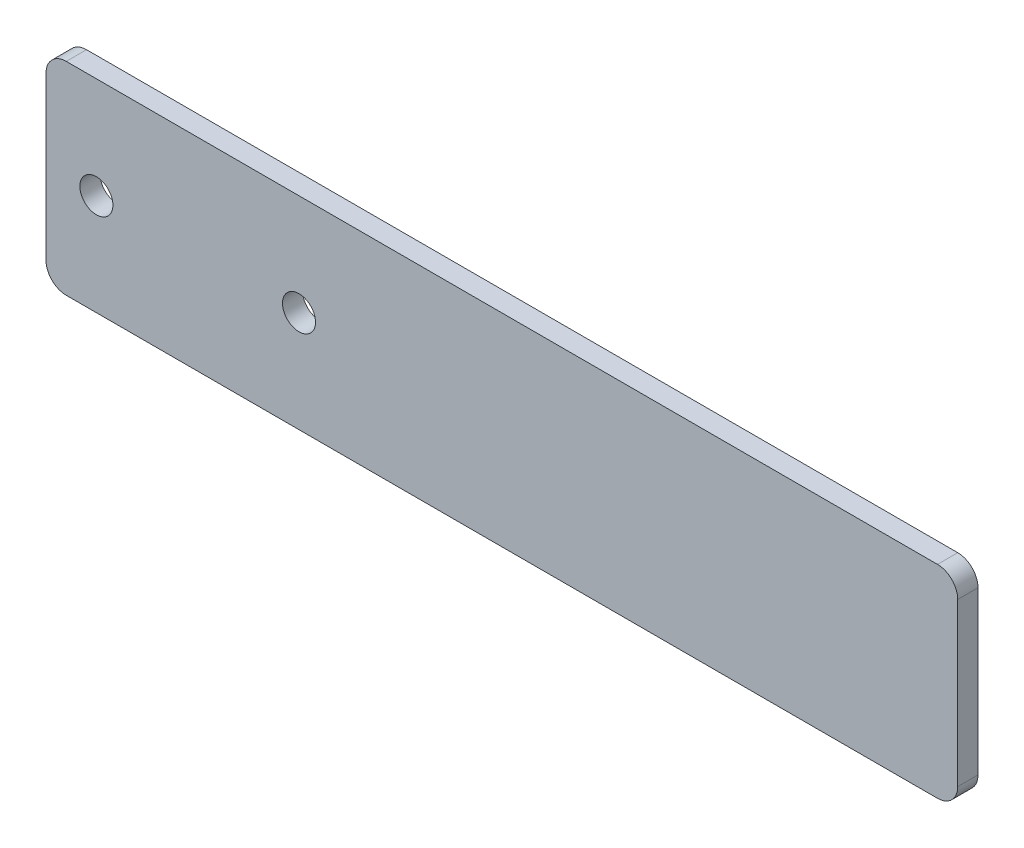
ISO-10303-21;
HEADER;
FILE_DESCRIPTION(('STEP AP214'),'2;1');
FILE_NAME('part.step','',(''),(''),'','','');
FILE_SCHEMA(('AUTOMOTIVE_DESIGN { 1 0 10303 214 1 1 1 1 }'));
ENDSEC;
DATA;
#1=APPLICATION_CONTEXT('core data for automotive mechanical design processes');
#2=APPLICATION_PROTOCOL_DEFINITION('international standard','automotive_design',2000,#1);
#3=PRODUCT_CONTEXT('',#1,'mechanical');
#4=PRODUCT('Part','Part','',(#3));
#5=PRODUCT_RELATED_PRODUCT_CATEGORY('part','',(#4));
#6=PRODUCT_DEFINITION_FORMATION('','',#4);
#7=PRODUCT_DEFINITION_CONTEXT('part definition',#1,'design');
#8=PRODUCT_DEFINITION('design','',#6,#7);
#9=PRODUCT_DEFINITION_SHAPE('','',#8);
#10=(LENGTH_UNIT() NAMED_UNIT(*) SI_UNIT(.MILLI.,.METRE.));
#11=(NAMED_UNIT(*) PLANE_ANGLE_UNIT() SI_UNIT($,.RADIAN.));
#12=(NAMED_UNIT(*) SI_UNIT($,.STERADIAN.) SOLID_ANGLE_UNIT());
#13=UNCERTAINTY_MEASURE_WITH_UNIT(LENGTH_MEASURE(1.E-05),#10,'distance_accuracy_value','');
#14=(GEOMETRIC_REPRESENTATION_CONTEXT(3) GLOBAL_UNCERTAINTY_ASSIGNED_CONTEXT((#13)) GLOBAL_UNIT_ASSIGNED_CONTEXT((#10,
#11,#12)) REPRESENTATION_CONTEXT('',''));
#15=CARTESIAN_POINT('',(0.,0.,0.));
#16=DIRECTION('',(0.,0.,1.));
#17=DIRECTION('',(1.,0.,0.));
#18=AXIS2_PLACEMENT_3D('',#15,#16,#17);
#19=CARTESIAN_POINT('',(0.,0.,2.54));
#20=DIRECTION('',(0.,0.,-1.));
#21=DIRECTION('',(-1.,0.,0.));
#22=AXIS2_PLACEMENT_3D('',#19,#20,#21);
#23=PLANE('',#22);
#24=DIRECTION('',(1.,0.,0.));
#25=VECTOR('',#24,1.);
#26=CARTESIAN_POINT('',(1628.44789263694,177.196529369141,2.54));
#27=LINE('',#26,#25);
#28=CARTESIAN_POINT('',(1516.68789263694,177.196529369141,2.54));
#29=VERTEX_POINT('',#28);
#30=CARTESIAN_POINT('',(1625.90789263694,177.196529369141,2.54));
#31=VERTEX_POINT('',#30);
#32=EDGE_CURVE('E210',#29,#31,#27,.T.);
#33=ORIENTED_EDGE('',*,*,#32,.T.);
#34=CARTESIAN_POINT('',(1625.90789263694,179.736529369141,2.54));
#35=DIRECTION('',(0.,0.,-1.));
#36=DIRECTION('',(-1.,0.,0.));
#37=AXIS2_PLACEMENT_3D('',#34,#35,#36);
#38=CIRCLE('',#37,2.54);
#39=CARTESIAN_POINT('',(1628.44789263694,179.736529369141,2.54));
#40=VERTEX_POINT('',#39);
#41=EDGE_CURVE('E189',#31,#40,#38,.F.);
#42=ORIENTED_EDGE('',*,*,#41,.T.);
#43=DIRECTION('',(0.,1.,0.));
#44=VECTOR('',#43,1.);
#45=CARTESIAN_POINT('',(1628.44789263694,202.596529369141,2.54));
#46=LINE('',#45,#44);
#47=CARTESIAN_POINT('',(1628.44789263694,200.056529369141,2.54));
#48=VERTEX_POINT('',#47);
#49=EDGE_CURVE('E145',#40,#48,#46,.T.);
#50=ORIENTED_EDGE('',*,*,#49,.T.);
#51=CARTESIAN_POINT('',(1625.90789263694,200.056529369141,2.54));
#52=DIRECTION('',(0.,0.,-1.));
#53=DIRECTION('',(-1.,0.,0.));
#54=AXIS2_PLACEMENT_3D('',#51,#52,#53);
#55=CIRCLE('',#54,2.54);
#56=CARTESIAN_POINT('',(1625.90789263694,202.596529369141,2.54));
#57=VERTEX_POINT('',#56);
#58=EDGE_CURVE('E186',#48,#57,#55,.F.);
#59=ORIENTED_EDGE('',*,*,#58,.T.);
#60=DIRECTION('',(-1.,0.,0.));
#61=VECTOR('',#60,1.);
#62=CARTESIAN_POINT('',(1514.14789263694,202.596529369141,2.54));
#63=LINE('',#62,#61);
#64=CARTESIAN_POINT('',(1516.68789263694,202.596529369141,2.54));
#65=VERTEX_POINT('',#64);
#66=EDGE_CURVE('E154',#57,#65,#63,.T.);
#67=ORIENTED_EDGE('',*,*,#66,.T.);
#68=CARTESIAN_POINT('',(1516.68789263694,200.056529369141,2.54));
#69=DIRECTION('',(0.,0.,-1.));
#70=DIRECTION('',(-1.,0.,0.));
#71=AXIS2_PLACEMENT_3D('',#68,#69,#70);
#72=CIRCLE('',#71,2.54);
#73=CARTESIAN_POINT('',(1514.14789263694,200.056529369141,2.54));
#74=VERTEX_POINT('',#73);
#75=EDGE_CURVE('E69',#65,#74,#72,.F.);
#76=ORIENTED_EDGE('',*,*,#75,.T.);
#77=DIRECTION('',(0.,-1.,0.));
#78=VECTOR('',#77,1.);
#79=CARTESIAN_POINT('',(1514.14789263694,177.196529369141,2.54));
#80=LINE('',#79,#78);
#81=CARTESIAN_POINT('',(1514.14789263694,179.736529369141,2.54));
#82=VERTEX_POINT('',#81);
#83=EDGE_CURVE('E160',#74,#82,#80,.T.);
#84=ORIENTED_EDGE('',*,*,#83,.T.);
#85=CARTESIAN_POINT('',(1516.68789263694,179.736529369141,2.54));
#86=DIRECTION('',(0.,0.,-1.));
#87=DIRECTION('',(-1.,0.,0.));
#88=AXIS2_PLACEMENT_3D('',#85,#86,#87);
#89=CIRCLE('',#88,2.54);
#90=EDGE_CURVE('E181',#82,#29,#89,.F.);
#91=ORIENTED_EDGE('',*,*,#90,.T.);
#92=EDGE_LOOP('',(#33,#42,#50,#59,#67,#76,#84,#91));
#93=FACE_BOUND('',#92,.T.);
#94=CARTESIAN_POINT('',(1545.8653348212,189.896529369176,2.54));
#95=DIRECTION('',(0.,0.,1.));
#96=DIRECTION('',(1.,0.,0.));
#97=AXIS2_PLACEMENT_3D('',#94,#95,#96);
#98=CIRCLE('',#97,2.07009999999992);
#99=CARTESIAN_POINT('',(1547.9354348212,189.896529369176,2.54));
#100=VERTEX_POINT('',#99);
#101=EDGE_CURVE('E214',#100,#100,#98,.T.);
#102=ORIENTED_EDGE('',*,*,#101,.F.);
#103=EDGE_LOOP('',(#102));
#104=FACE_BOUND('',#103,.T.);
#105=CARTESIAN_POINT('',(1520.4653348212,189.896529369168,2.54));
#106=DIRECTION('',(0.,0.,1.));
#107=DIRECTION('',(1.,0.,0.));
#108=AXIS2_PLACEMENT_3D('',#105,#106,#107);
#109=CIRCLE('',#108,2.07009999999992);
#110=CARTESIAN_POINT('',(1522.5354348212,189.896529369168,2.54));
#111=VERTEX_POINT('',#110);
#112=EDGE_CURVE('E200',#111,#111,#109,.T.);
#113=ORIENTED_EDGE('',*,*,#112,.F.);
#114=EDGE_LOOP('',(#113));
#115=FACE_BOUND('',#114,.T.);
#116=ADVANCED_FACE('F41',(#93,#104,#115),#23,.F.);
#117=CARTESIAN_POINT('',(0.,0.,0.));
#118=DIRECTION('',(0.,0.,-1.));
#119=DIRECTION('',(-1.,0.,0.));
#120=AXIS2_PLACEMENT_3D('',#117,#118,#119);
#121=PLANE('',#120);
#122=CARTESIAN_POINT('',(1545.8653348212,189.896529369176,0.));
#123=DIRECTION('',(0.,0.,1.));
#124=DIRECTION('',(1.,0.,0.));
#125=AXIS2_PLACEMENT_3D('',#122,#123,#124);
#126=CIRCLE('',#125,2.07009999999992);
#127=CARTESIAN_POINT('',(1547.9354348212,189.896529369176,0.));
#128=VERTEX_POINT('',#127);
#129=EDGE_CURVE('E203',#128,#128,#126,.T.);
#130=ORIENTED_EDGE('',*,*,#129,.T.);
#131=EDGE_LOOP('',(#130));
#132=FACE_BOUND('',#131,.T.);
#133=DIRECTION('',(0.,1.,0.));
#134=VECTOR('',#133,1.);
#135=CARTESIAN_POINT('',(1628.44789263694,202.596529369141,0.));
#136=LINE('',#135,#134);
#137=CARTESIAN_POINT('',(1628.44789263694,179.736529369141,0.));
#138=VERTEX_POINT('',#137);
#139=CARTESIAN_POINT('',(1628.44789263694,200.056529369141,0.));
#140=VERTEX_POINT('',#139);
#141=EDGE_CURVE('E142',#138,#140,#136,.T.);
#142=ORIENTED_EDGE('',*,*,#141,.F.);
#143=CARTESIAN_POINT('',(1625.90789263694,179.736529369141,0.));
#144=DIRECTION('',(0.,0.,-1.));
#145=DIRECTION('',(-1.,0.,0.));
#146=AXIS2_PLACEMENT_3D('',#143,#144,#145);
#147=CIRCLE('',#146,2.54);
#148=CARTESIAN_POINT('',(1625.90789263694,177.196529369141,0.));
#149=VERTEX_POINT('',#148);
#150=EDGE_CURVE('E124',#138,#149,#147,.T.);
#151=ORIENTED_EDGE('',*,*,#150,.T.);
#152=DIRECTION('',(1.,0.,0.));
#153=VECTOR('',#152,1.);
#154=CARTESIAN_POINT('',(1628.44789263694,177.196529369141,0.));
#155=LINE('',#154,#153);
#156=CARTESIAN_POINT('',(1516.68789263694,177.196529369141,0.));
#157=VERTEX_POINT('',#156);
#158=EDGE_CURVE('E155',#157,#149,#155,.T.);
#159=ORIENTED_EDGE('',*,*,#158,.F.);
#160=CARTESIAN_POINT('',(1516.68789263694,179.736529369141,0.));
#161=DIRECTION('',(0.,0.,-1.));
#162=DIRECTION('',(-1.,0.,0.));
#163=AXIS2_PLACEMENT_3D('',#160,#161,#162);
#164=CIRCLE('',#163,2.54);
#165=CARTESIAN_POINT('',(1514.14789263694,179.736529369141,0.));
#166=VERTEX_POINT('',#165);
#167=EDGE_CURVE('E147',#157,#166,#164,.T.);
#168=ORIENTED_EDGE('',*,*,#167,.T.);
#169=DIRECTION('',(0.,-1.,0.));
#170=VECTOR('',#169,1.);
#171=CARTESIAN_POINT('',(1514.14789263694,177.196529369141,0.));
#172=LINE('',#171,#170);
#173=CARTESIAN_POINT('',(1514.14789263694,200.056529369141,0.));
#174=VERTEX_POINT('',#173);
#175=EDGE_CURVE('E163',#174,#166,#172,.T.);
#176=ORIENTED_EDGE('',*,*,#175,.F.);
#177=CARTESIAN_POINT('',(1516.68789263694,200.056529369141,0.));
#178=DIRECTION('',(0.,0.,-1.));
#179=DIRECTION('',(-1.,0.,0.));
#180=AXIS2_PLACEMENT_3D('',#177,#178,#179);
#181=CIRCLE('',#180,2.54);
#182=CARTESIAN_POINT('',(1516.68789263694,202.596529369141,0.));
#183=VERTEX_POINT('',#182);
#184=EDGE_CURVE('E171',#174,#183,#181,.T.);
#185=ORIENTED_EDGE('',*,*,#184,.T.);
#186=DIRECTION('',(-1.,0.,0.));
#187=VECTOR('',#186,1.);
#188=CARTESIAN_POINT('',(1514.14789263694,202.596529369141,0.));
#189=LINE('',#188,#187);
#190=CARTESIAN_POINT('',(1625.90789263694,202.596529369141,0.));
#191=VERTEX_POINT('',#190);
#192=EDGE_CURVE('E213',#191,#183,#189,.T.);
#193=ORIENTED_EDGE('',*,*,#192,.F.);
#194=CARTESIAN_POINT('',(1625.90789263694,200.056529369141,0.));
#195=DIRECTION('',(0.,0.,-1.));
#196=DIRECTION('',(-1.,0.,0.));
#197=AXIS2_PLACEMENT_3D('',#194,#195,#196);
#198=CIRCLE('',#197,2.54);
#199=EDGE_CURVE('E136',#191,#140,#198,.T.);
#200=ORIENTED_EDGE('',*,*,#199,.T.);
#201=EDGE_LOOP('',(#142,#151,#159,#168,#176,#185,#193,#200));
#202=FACE_BOUND('',#201,.T.);
#203=CARTESIAN_POINT('',(1520.4653348212,189.896529369168,0.));
#204=DIRECTION('',(0.,0.,1.));
#205=DIRECTION('',(1.,0.,0.));
#206=AXIS2_PLACEMENT_3D('',#203,#204,#205);
#207=CIRCLE('',#206,2.07009999999992);
#208=CARTESIAN_POINT('',(1522.5354348212,189.896529369168,0.));
#209=VERTEX_POINT('',#208);
#210=EDGE_CURVE('E204',#209,#209,#207,.T.);
#211=ORIENTED_EDGE('',*,*,#210,.T.);
#212=EDGE_LOOP('',(#211));
#213=FACE_BOUND('',#212,.T.);
#214=ADVANCED_FACE('F150',(#132,#202,#213),#121,.T.);
#215=CARTESIAN_POINT('',(1514.14789263694,202.596529369141,2.54));
#216=DIRECTION('',(0.,-1.,0.));
#217=DIRECTION('',(0.,0.,-1.));
#218=AXIS2_PLACEMENT_3D('',#215,#216,#217);
#219=PLANE('',#218);
#220=ORIENTED_EDGE('',*,*,#66,.F.);
#221=DIRECTION('',(0.,0.,-1.));
#222=VECTOR('',#221,1.);
#223=CARTESIAN_POINT('',(1625.90789263694,202.596529369141,2.54));
#224=LINE('',#223,#222);
#225=EDGE_CURVE('E195',#57,#191,#224,.T.);
#226=ORIENTED_EDGE('',*,*,#225,.T.);
#227=ORIENTED_EDGE('',*,*,#192,.T.);
#228=DIRECTION('',(0.,0.,-1.));
#229=VECTOR('',#228,1.);
#230=CARTESIAN_POINT('',(1516.68789263694,202.596529369141,2.54));
#231=LINE('',#230,#229);
#232=EDGE_CURVE('E192',#183,#65,#231,.F.);
#233=ORIENTED_EDGE('',*,*,#232,.T.);
#234=EDGE_LOOP('',(#220,#226,#227,#233));
#235=FACE_BOUND('',#234,.T.);
#236=ADVANCED_FACE('F242',(#235),#219,.F.);
#237=CARTESIAN_POINT('',(1514.14789263694,177.196529369141,2.54));
#238=DIRECTION('',(1.,0.,0.));
#239=DIRECTION('',(0.,0.,-1.));
#240=AXIS2_PLACEMENT_3D('',#237,#238,#239);
#241=PLANE('',#240);
#242=ORIENTED_EDGE('',*,*,#83,.F.);
#243=DIRECTION('',(0.,0.,-1.));
#244=VECTOR('',#243,1.);
#245=CARTESIAN_POINT('',(1514.14789263694,200.056529369141,2.54));
#246=LINE('',#245,#244);
#247=EDGE_CURVE('E11',#74,#174,#246,.T.);
#248=ORIENTED_EDGE('',*,*,#247,.T.);
#249=ORIENTED_EDGE('',*,*,#175,.T.);
#250=DIRECTION('',(0.,0.,-1.));
#251=VECTOR('',#250,1.);
#252=CARTESIAN_POINT('',(1514.14789263694,179.736529369141,2.54));
#253=LINE('',#252,#251);
#254=EDGE_CURVE('E50',#166,#82,#253,.F.);
#255=ORIENTED_EDGE('',*,*,#254,.T.);
#256=EDGE_LOOP('',(#242,#248,#249,#255));
#257=FACE_BOUND('',#256,.T.);
#258=ADVANCED_FACE('F235',(#257),#241,.F.);
#259=CARTESIAN_POINT('',(1628.44789263694,177.196529369141,2.54));
#260=DIRECTION('',(0.,1.,0.));
#261=DIRECTION('',(0.,0.,1.));
#262=AXIS2_PLACEMENT_3D('',#259,#260,#261);
#263=PLANE('',#262);
#264=ORIENTED_EDGE('',*,*,#158,.T.);
#265=DIRECTION('',(0.,0.,-1.));
#266=VECTOR('',#265,1.);
#267=CARTESIAN_POINT('',(1625.90789263694,177.196529369141,2.54));
#268=LINE('',#267,#266);
#269=EDGE_CURVE('E129',#149,#31,#268,.F.);
#270=ORIENTED_EDGE('',*,*,#269,.T.);
#271=ORIENTED_EDGE('',*,*,#32,.F.);
#272=DIRECTION('',(0.,0.,-1.));
#273=VECTOR('',#272,1.);
#274=CARTESIAN_POINT('',(1516.68789263694,177.196529369141,2.54));
#275=LINE('',#274,#273);
#276=EDGE_CURVE('E135',#29,#157,#275,.T.);
#277=ORIENTED_EDGE('',*,*,#276,.T.);
#278=EDGE_LOOP('',(#264,#270,#271,#277));
#279=FACE_BOUND('',#278,.T.);
#280=ADVANCED_FACE('F232',(#279),#263,.F.);
#281=CARTESIAN_POINT('',(1628.44789263694,202.596529369141,2.54));
#282=DIRECTION('',(-1.,0.,0.));
#283=DIRECTION('',(0.,0.,1.));
#284=AXIS2_PLACEMENT_3D('',#281,#282,#283);
#285=PLANE('',#284);
#286=ORIENTED_EDGE('',*,*,#49,.F.);
#287=DIRECTION('',(0.,0.,-1.));
#288=VECTOR('',#287,1.);
#289=CARTESIAN_POINT('',(1628.44789263694,179.736529369141,2.54));
#290=LINE('',#289,#288);
#291=EDGE_CURVE('E128',#40,#138,#290,.T.);
#292=ORIENTED_EDGE('',*,*,#291,.T.);
#293=ORIENTED_EDGE('',*,*,#141,.T.);
#294=DIRECTION('',(0.,0.,-1.));
#295=VECTOR('',#294,1.);
#296=CARTESIAN_POINT('',(1628.44789263694,200.056529369141,2.54));
#297=LINE('',#296,#295);
#298=EDGE_CURVE('E148',#140,#48,#297,.F.);
#299=ORIENTED_EDGE('',*,*,#298,.T.);
#300=EDGE_LOOP('',(#286,#292,#293,#299));
#301=FACE_BOUND('',#300,.T.);
#302=ADVANCED_FACE('F141',(#301),#285,.F.);
#303=CARTESIAN_POINT('',(1545.8653348212,189.896529369176,2.54));
#304=DIRECTION('',(0.,0.,-1.));
#305=DIRECTION('',(-1.,0.,0.));
#306=AXIS2_PLACEMENT_3D('',#303,#304,#305);
#307=CYLINDRICAL_SURFACE('',#306,2.07009999999992);
#308=ORIENTED_EDGE('',*,*,#101,.T.);
#309=EDGE_LOOP('',(#308));
#310=FACE_BOUND('',#309,.T.);
#311=ORIENTED_EDGE('',*,*,#129,.F.);
#312=EDGE_LOOP('',(#311));
#313=FACE_BOUND('',#312,.T.);
#314=ADVANCED_FACE('F262',(#310,#313),#307,.F.);
#315=CARTESIAN_POINT('',(1520.4653348212,189.896529369168,2.54));
#316=DIRECTION('',(0.,0.,-1.));
#317=DIRECTION('',(-1.,0.,0.));
#318=AXIS2_PLACEMENT_3D('',#315,#316,#317);
#319=CYLINDRICAL_SURFACE('',#318,2.07009999999992);
#320=ORIENTED_EDGE('',*,*,#112,.T.);
#321=EDGE_LOOP('',(#320));
#322=FACE_BOUND('',#321,.T.);
#323=ORIENTED_EDGE('',*,*,#210,.F.);
#324=EDGE_LOOP('',(#323));
#325=FACE_BOUND('',#324,.T.);
#326=ADVANCED_FACE('F252',(#322,#325),#319,.F.);
#327=CARTESIAN_POINT('',(1625.90789263694,179.736529369141,2.54));
#328=DIRECTION('',(0.,0.,-1.));
#329=DIRECTION('',(-1.,0.,0.));
#330=AXIS2_PLACEMENT_3D('',#327,#328,#329);
#331=CYLINDRICAL_SURFACE('',#330,2.54);
#332=ORIENTED_EDGE('',*,*,#41,.F.);
#333=ORIENTED_EDGE('',*,*,#269,.F.);
#334=ORIENTED_EDGE('',*,*,#150,.F.);
#335=ORIENTED_EDGE('',*,*,#291,.F.);
#336=EDGE_LOOP('',(#332,#333,#334,#335));
#337=FACE_BOUND('',#336,.T.);
#338=ADVANCED_FACE('F127',(#337),#331,.T.);
#339=CARTESIAN_POINT('',(1625.90789263694,200.056529369141,2.54));
#340=DIRECTION('',(0.,0.,-1.));
#341=DIRECTION('',(-1.,0.,0.));
#342=AXIS2_PLACEMENT_3D('',#339,#340,#341);
#343=CYLINDRICAL_SURFACE('',#342,2.54);
#344=ORIENTED_EDGE('',*,*,#58,.F.);
#345=ORIENTED_EDGE('',*,*,#298,.F.);
#346=ORIENTED_EDGE('',*,*,#199,.F.);
#347=ORIENTED_EDGE('',*,*,#225,.F.);
#348=EDGE_LOOP('',(#344,#345,#346,#347));
#349=FACE_BOUND('',#348,.T.);
#350=ADVANCED_FACE('F245',(#349),#343,.T.);
#351=CARTESIAN_POINT('',(1516.68789263694,200.056529369141,2.54));
#352=DIRECTION('',(0.,0.,-1.));
#353=DIRECTION('',(-1.,0.,0.));
#354=AXIS2_PLACEMENT_3D('',#351,#352,#353);
#355=CYLINDRICAL_SURFACE('',#354,2.54);
#356=ORIENTED_EDGE('',*,*,#75,.F.);
#357=ORIENTED_EDGE('',*,*,#232,.F.);
#358=ORIENTED_EDGE('',*,*,#184,.F.);
#359=ORIENTED_EDGE('',*,*,#247,.F.);
#360=EDGE_LOOP('',(#356,#357,#358,#359));
#361=FACE_BOUND('',#360,.T.);
#362=ADVANCED_FACE('F238',(#361),#355,.T.);
#363=CARTESIAN_POINT('',(1516.68789263694,179.736529369141,2.54));
#364=DIRECTION('',(0.,0.,-1.));
#365=DIRECTION('',(-1.,0.,0.));
#366=AXIS2_PLACEMENT_3D('',#363,#364,#365);
#367=CYLINDRICAL_SURFACE('',#366,2.54);
#368=ORIENTED_EDGE('',*,*,#90,.F.);
#369=ORIENTED_EDGE('',*,*,#254,.F.);
#370=ORIENTED_EDGE('',*,*,#167,.F.);
#371=ORIENTED_EDGE('',*,*,#276,.F.);
#372=EDGE_LOOP('',(#368,#369,#370,#371));
#373=FACE_BOUND('',#372,.T.);
#374=ADVANCED_FACE('F43',(#373),#367,.T.);
#375=CLOSED_SHELL('',(#116,#214,#236,#258,#280,#302,#314,#326,#338,#350,#362,#374));
#376=MANIFOLD_SOLID_BREP('B2',#375);
#377=ADVANCED_BREP_SHAPE_REPRESENTATION('',(#18,#376),#14);
#378=SHAPE_DEFINITION_REPRESENTATION(#9,#377);
ENDSEC;
END-ISO-10303-21;
